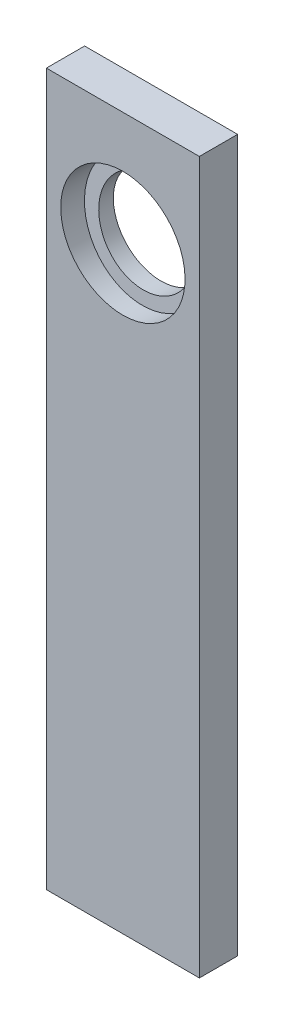
ISO-10303-21;
HEADER;
FILE_DESCRIPTION(('STEP AP214'),'2;1');
FILE_NAME('part.step','',(''),(''),'','','');
FILE_SCHEMA(('AUTOMOTIVE_DESIGN { 1 0 10303 214 1 1 1 1 }'));
ENDSEC;
DATA;
#1=APPLICATION_CONTEXT('core data for automotive mechanical design processes');
#2=APPLICATION_PROTOCOL_DEFINITION('international standard','automotive_design',2000,#1);
#3=PRODUCT_CONTEXT('',#1,'mechanical');
#4=PRODUCT('Part','Part','',(#3));
#5=PRODUCT_RELATED_PRODUCT_CATEGORY('part','',(#4));
#6=PRODUCT_DEFINITION_FORMATION('','',#4);
#7=PRODUCT_DEFINITION_CONTEXT('part definition',#1,'design');
#8=PRODUCT_DEFINITION('design','',#6,#7);
#9=PRODUCT_DEFINITION_SHAPE('','',#8);
#10=(LENGTH_UNIT() NAMED_UNIT(*) SI_UNIT(.MILLI.,.METRE.));
#11=(NAMED_UNIT(*) PLANE_ANGLE_UNIT() SI_UNIT($,.RADIAN.));
#12=(NAMED_UNIT(*) SI_UNIT($,.STERADIAN.) SOLID_ANGLE_UNIT());
#13=UNCERTAINTY_MEASURE_WITH_UNIT(LENGTH_MEASURE(1.E-05),#10,'distance_accuracy_value','');
#14=(GEOMETRIC_REPRESENTATION_CONTEXT(3) GLOBAL_UNCERTAINTY_ASSIGNED_CONTEXT((#13)) GLOBAL_UNIT_ASSIGNED_CONTEXT((#10,
#11,#12)) REPRESENTATION_CONTEXT('',''));
#15=CARTESIAN_POINT('',(0.,0.,0.));
#16=DIRECTION('',(0.,0.,1.));
#17=DIRECTION('',(1.,0.,0.));
#18=AXIS2_PLACEMENT_3D('',#15,#16,#17);
#19=CARTESIAN_POINT('',(40.,186.,20.));
#20=DIRECTION('',(-1.,0.,0.));
#21=DIRECTION('',(0.,-1.,0.));
#22=AXIS2_PLACEMENT_3D('',#19,#20,#21);
#23=PLANE('',#22);
#24=DIRECTION('',(0.,1.,0.));
#25=VECTOR('',#24,1.);
#26=CARTESIAN_POINT('',(40.,186.,0.));
#27=LINE('',#26,#25);
#28=CARTESIAN_POINT('',(40.,-186.,0.));
#29=VERTEX_POINT('',#28);
#30=CARTESIAN_POINT('',(40.,186.,0.));
#31=VERTEX_POINT('',#30);
#32=EDGE_CURVE('E110',#29,#31,#27,.T.);
#33=ORIENTED_EDGE('',*,*,#32,.T.);
#34=DIRECTION('',(0.,0.,-1.));
#35=VECTOR('',#34,1.);
#36=CARTESIAN_POINT('',(40.,186.,20.));
#37=LINE('',#36,#35);
#38=CARTESIAN_POINT('',(40.,186.,20.));
#39=VERTEX_POINT('',#38);
#40=EDGE_CURVE('E11',#39,#31,#37,.T.);
#41=ORIENTED_EDGE('',*,*,#40,.F.);
#42=DIRECTION('',(0.,1.,0.));
#43=VECTOR('',#42,1.);
#44=CARTESIAN_POINT('',(40.,186.,20.));
#45=LINE('',#44,#43);
#46=CARTESIAN_POINT('',(40.,-186.,20.));
#47=VERTEX_POINT('',#46);
#48=EDGE_CURVE('E93',#47,#39,#45,.T.);
#49=ORIENTED_EDGE('',*,*,#48,.F.);
#50=DIRECTION('',(0.,0.,-1.));
#51=VECTOR('',#50,1.);
#52=CARTESIAN_POINT('',(40.,-186.,20.));
#53=LINE('',#52,#51);
#54=EDGE_CURVE('E106',#47,#29,#53,.T.);
#55=ORIENTED_EDGE('',*,*,#54,.T.);
#56=EDGE_LOOP('',(#33,#41,#49,#55));
#57=FACE_BOUND('',#56,.T.);
#58=ADVANCED_FACE('F39',(#57),#23,.F.);
#59=CARTESIAN_POINT('',(-40.,186.,20.));
#60=DIRECTION('',(0.,-1.,0.));
#61=DIRECTION('',(0.,0.,-1.));
#62=AXIS2_PLACEMENT_3D('',#59,#60,#61);
#63=PLANE('',#62);
#64=DIRECTION('',(-1.,0.,0.));
#65=VECTOR('',#64,1.);
#66=CARTESIAN_POINT('',(-40.,186.,0.));
#67=LINE('',#66,#65);
#68=CARTESIAN_POINT('',(-40.,186.,0.));
#69=VERTEX_POINT('',#68);
#70=EDGE_CURVE('E98',#31,#69,#67,.T.);
#71=ORIENTED_EDGE('',*,*,#70,.T.);
#72=DIRECTION('',(0.,0.,-1.));
#73=VECTOR('',#72,1.);
#74=CARTESIAN_POINT('',(-40.,186.,20.));
#75=LINE('',#74,#73);
#76=CARTESIAN_POINT('',(-40.,186.,20.));
#77=VERTEX_POINT('',#76);
#78=EDGE_CURVE('E49',#77,#69,#75,.T.);
#79=ORIENTED_EDGE('',*,*,#78,.F.);
#80=DIRECTION('',(-1.,0.,0.));
#81=VECTOR('',#80,1.);
#82=CARTESIAN_POINT('',(-40.,186.,20.));
#83=LINE('',#82,#81);
#84=EDGE_CURVE('E88',#39,#77,#83,.T.);
#85=ORIENTED_EDGE('',*,*,#84,.F.);
#86=ORIENTED_EDGE('',*,*,#40,.T.);
#87=EDGE_LOOP('',(#71,#79,#85,#86));
#88=FACE_BOUND('',#87,.T.);
#89=ADVANCED_FACE('F97',(#88),#63,.F.);
#90=CARTESIAN_POINT('',(-40.,186.,20.));
#91=DIRECTION('',(1.,0.,0.));
#92=DIRECTION('',(0.,1.,0.));
#93=AXIS2_PLACEMENT_3D('',#90,#91,#92);
#94=PLANE('',#93);
#95=DIRECTION('',(0.,-1.,0.));
#96=VECTOR('',#95,1.);
#97=CARTESIAN_POINT('',(-40.,186.,0.));
#98=LINE('',#97,#96);
#99=CARTESIAN_POINT('',(-40.,-186.,0.));
#100=VERTEX_POINT('',#99);
#101=EDGE_CURVE('E75',#69,#100,#98,.T.);
#102=ORIENTED_EDGE('',*,*,#101,.T.);
#103=DIRECTION('',(0.,0.,-1.));
#104=VECTOR('',#103,1.);
#105=CARTESIAN_POINT('',(-40.,-186.,20.));
#106=LINE('',#105,#104);
#107=CARTESIAN_POINT('',(-40.,-186.,20.));
#108=VERTEX_POINT('',#107);
#109=EDGE_CURVE('E100',#108,#100,#106,.T.);
#110=ORIENTED_EDGE('',*,*,#109,.F.);
#111=DIRECTION('',(0.,-1.,0.));
#112=VECTOR('',#111,1.);
#113=CARTESIAN_POINT('',(-40.,186.,20.));
#114=LINE('',#113,#112);
#115=EDGE_CURVE('E91',#77,#108,#114,.T.);
#116=ORIENTED_EDGE('',*,*,#115,.F.);
#117=ORIENTED_EDGE('',*,*,#78,.T.);
#118=EDGE_LOOP('',(#102,#110,#116,#117));
#119=FACE_BOUND('',#118,.T.);
#120=ADVANCED_FACE('F102',(#119),#94,.F.);
#121=CARTESIAN_POINT('',(-40.,-186.,20.));
#122=DIRECTION('',(0.,1.,0.));
#123=DIRECTION('',(0.,0.,1.));
#124=AXIS2_PLACEMENT_3D('',#121,#122,#123);
#125=PLANE('',#124);
#126=DIRECTION('',(1.,0.,0.));
#127=VECTOR('',#126,1.);
#128=CARTESIAN_POINT('',(-40.,-186.,0.));
#129=LINE('',#128,#127);
#130=EDGE_CURVE('E81',#100,#29,#129,.T.);
#131=ORIENTED_EDGE('',*,*,#130,.T.);
#132=ORIENTED_EDGE('',*,*,#54,.F.);
#133=DIRECTION('',(1.,0.,0.));
#134=VECTOR('',#133,1.);
#135=CARTESIAN_POINT('',(-40.,-186.,20.));
#136=LINE('',#135,#134);
#137=EDGE_CURVE('E58',#108,#47,#136,.T.);
#138=ORIENTED_EDGE('',*,*,#137,.F.);
#139=ORIENTED_EDGE('',*,*,#109,.T.);
#140=EDGE_LOOP('',(#131,#132,#138,#139));
#141=FACE_BOUND('',#140,.T.);
#142=ADVANCED_FACE('F171',(#141),#125,.F.);
#143=CARTESIAN_POINT('',(0.,0.,20.));
#144=DIRECTION('',(0.,0.,1.));
#145=DIRECTION('',(1.,0.,0.));
#146=AXIS2_PLACEMENT_3D('',#143,#144,#145);
#147=PLANE('',#146);
#148=CARTESIAN_POINT('',(0.,126.699268119435,20.));
#149=DIRECTION('',(0.,0.,1.));
#150=DIRECTION('',(0.,-1.,0.));
#151=AXIS2_PLACEMENT_3D('',#148,#149,#150);
#152=ELLIPSE('',#151,32.5793616876381,32.5);
#153=CARTESIAN_POINT('',(0.,94.119906431797,20.));
#154=VERTEX_POINT('',#153);
#155=EDGE_CURVE('E114',#154,#154,#152,.T.);
#156=ORIENTED_EDGE('',*,*,#155,.F.);
#157=EDGE_LOOP('',(#156));
#158=FACE_BOUND('',#157,.T.);
#159=ORIENTED_EDGE('',*,*,#48,.T.);
#160=ORIENTED_EDGE('',*,*,#84,.T.);
#161=ORIENTED_EDGE('',*,*,#115,.T.);
#162=ORIENTED_EDGE('',*,*,#137,.T.);
#163=EDGE_LOOP('',(#159,#160,#161,#162));
#164=FACE_BOUND('',#163,.T.);
#165=ADVANCED_FACE('F89',(#158,#164),#147,.T.);
#166=CARTESIAN_POINT('',(0.,0.,0.));
#167=DIRECTION('',(0.,0.,1.));
#168=DIRECTION('',(1.,0.,0.));
#169=AXIS2_PLACEMENT_3D('',#166,#167,#168);
#170=PLANE('',#169);
#171=CARTESIAN_POINT('',(0.,124.60146376113,0.));
#172=DIRECTION('',(0.,0.,1.));
#173=DIRECTION('',(0.,1.,0.));
#174=AXIS2_PLACEMENT_3D('',#171,#172,#173);
#175=ELLIPSE('',#174,25.0610474520293,25.);
#176=CARTESIAN_POINT('',(0.,149.662511213159,0.));
#177=VERTEX_POINT('',#176);
#178=EDGE_CURVE('E42',#177,#177,#175,.T.);
#179=ORIENTED_EDGE('',*,*,#178,.T.);
#180=EDGE_LOOP('',(#179));
#181=FACE_BOUND('',#180,.T.);
#182=ORIENTED_EDGE('',*,*,#32,.F.);
#183=ORIENTED_EDGE('',*,*,#130,.F.);
#184=ORIENTED_EDGE('',*,*,#101,.F.);
#185=ORIENTED_EDGE('',*,*,#70,.F.);
#186=EDGE_LOOP('',(#182,#183,#184,#185));
#187=FACE_BOUND('',#186,.T.);
#188=ADVANCED_FACE('F156',(#181,#187),#170,.F.);
#189=CARTESIAN_POINT('',(0.,126.987823442553,24.12653337251));
#190=DIRECTION('',(0.,-0.0697564737441289,-0.997564050259824));
#191=DIRECTION('',(0.,0.997564050259824,-0.0697564737441289));
#192=AXIS2_PLACEMENT_3D('',#189,#190,#191);
#193=CYLINDRICAL_SURFACE('',#192,32.5);
#194=ORIENTED_EDGE('',*,*,#155,.T.);
#195=EDGE_LOOP('',(#194));
#196=FACE_BOUND('',#195,.T.);
#197=CARTESIAN_POINT('',(0.,125.8260336238,7.51216491407304));
#198=DIRECTION('',(0.,-0.0697564737441289,-0.997564050259824));
#199=DIRECTION('',(0.,0.997564050259824,-0.0697564737441289));
#200=AXIS2_PLACEMENT_3D('',#197,#198,#199);
#201=CIRCLE('',#200,32.5);
#202=CARTESIAN_POINT('',(0.,158.246865257244,5.24507951738885));
#203=VERTEX_POINT('',#202);
#204=EDGE_CURVE('E126',#203,#203,#201,.T.);
#205=ORIENTED_EDGE('',*,*,#204,.T.);
#206=EDGE_LOOP('',(#205));
#207=FACE_BOUND('',#206,.T.);
#208=ADVANCED_FACE('F149',(#196,#207),#193,.F.);
#209=CARTESIAN_POINT('',(0.,125.8260336238,7.51216491407304));
#210=DIRECTION('',(0.,-0.0697564737441289,-0.997564050259824));
#211=DIRECTION('',(0.,0.997564050259824,-0.0697564737441289));
#212=AXIS2_PLACEMENT_3D('',#209,#210,#211);
#213=PLANE('',#212);
#214=CARTESIAN_POINT('',(0.,125.130168119,7.56082457036519));
#215=DIRECTION('',(0.,0.0697564737441289,0.997564050259824));
#216=DIRECTION('',(0.,-0.997564050259824,0.0697564737441289));
#217=AXIS2_PLACEMENT_3D('',#214,#215,#216);
#218=CIRCLE('',#217,25.);
#219=CARTESIAN_POINT('',(0.,100.191066862504,9.30473641396841));
#220=VERTEX_POINT('',#219);
#221=EDGE_CURVE('E136',#220,#220,#218,.T.);
#222=ORIENTED_EDGE('',*,*,#221,.F.);
#223=EDGE_LOOP('',(#222));
#224=FACE_BOUND('',#223,.T.);
#225=ORIENTED_EDGE('',*,*,#204,.F.);
#226=EDGE_LOOP('',(#225));
#227=FACE_BOUND('',#226,.T.);
#228=ADVANCED_FACE('F146',(#224,#227),#213,.F.);
#229=CARTESIAN_POINT('',(0.,123.090087714084,-21.613684437187));
#230=DIRECTION('',(0.,0.0697564737441289,0.997564050259824));
#231=DIRECTION('',(0.,-0.997564050259824,0.0697564737441289));
#232=AXIS2_PLACEMENT_3D('',#229,#230,#231);
#233=CYLINDRICAL_SURFACE('',#232,25.);
#234=ORIENTED_EDGE('',*,*,#221,.T.);
#235=EDGE_LOOP('',(#234));
#236=FACE_BOUND('',#235,.T.);
#237=ORIENTED_EDGE('',*,*,#178,.F.);
#238=EDGE_LOOP('',(#237));
#239=FACE_BOUND('',#238,.T.);
#240=ADVANCED_FACE('F143',(#236,#239),#233,.F.);
#241=CLOSED_SHELL('',(#58,#89,#120,#142,#165,#188,#208,#228,#240));
#242=MANIFOLD_SOLID_BREP('B2',#241);
#243=ADVANCED_BREP_SHAPE_REPRESENTATION('',(#18,#242),#14);
#244=SHAPE_DEFINITION_REPRESENTATION(#9,#243);
ENDSEC;
END-ISO-10303-21;
